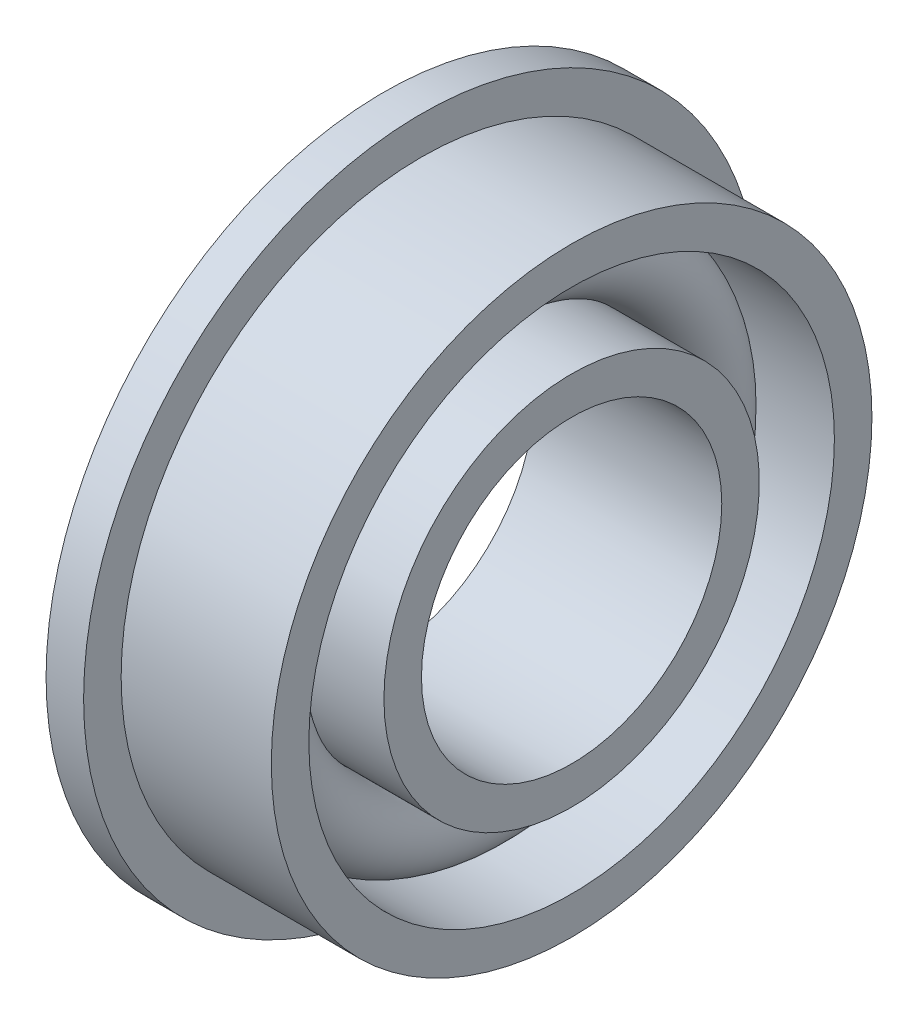
ISO-10303-21;
HEADER;
FILE_DESCRIPTION(('STEP AP214'),'2;1');
FILE_NAME('part.step','',(''),(''),'','','');
FILE_SCHEMA(('AUTOMOTIVE_DESIGN { 1 0 10303 214 1 1 1 1 }'));
ENDSEC;
DATA;
#1=APPLICATION_CONTEXT('core data for automotive mechanical design processes');
#2=APPLICATION_PROTOCOL_DEFINITION('international standard','automotive_design',2000,#1);
#3=PRODUCT_CONTEXT('',#1,'mechanical');
#4=PRODUCT('Part','Part','',(#3));
#5=PRODUCT_RELATED_PRODUCT_CATEGORY('part','',(#4));
#6=PRODUCT_DEFINITION_FORMATION('','',#4);
#7=PRODUCT_DEFINITION_CONTEXT('part definition',#1,'design');
#8=PRODUCT_DEFINITION('design','',#6,#7);
#9=PRODUCT_DEFINITION_SHAPE('','',#8);
#10=(LENGTH_UNIT() NAMED_UNIT(*) SI_UNIT(.MILLI.,.METRE.));
#11=(NAMED_UNIT(*) PLANE_ANGLE_UNIT() SI_UNIT($,.RADIAN.));
#12=(NAMED_UNIT(*) SI_UNIT($,.STERADIAN.) SOLID_ANGLE_UNIT());
#13=UNCERTAINTY_MEASURE_WITH_UNIT(LENGTH_MEASURE(1.E-05),#10,'distance_accuracy_value','');
#14=(GEOMETRIC_REPRESENTATION_CONTEXT(3) GLOBAL_UNCERTAINTY_ASSIGNED_CONTEXT((#13)) GLOBAL_UNIT_ASSIGNED_CONTEXT((#10,
#11,#12)) REPRESENTATION_CONTEXT('',''));
#15=CARTESIAN_POINT('',(0.,0.,0.));
#16=DIRECTION('',(0.,0.,1.));
#17=DIRECTION('',(1.,0.,0.));
#18=AXIS2_PLACEMENT_3D('',#15,#16,#17);
#19=CARTESIAN_POINT('',(0.,0.,0.));
#20=DIRECTION('',(-1.,0.,0.));
#21=DIRECTION('',(0.,0.,1.));
#22=AXIS2_PLACEMENT_3D('',#19,#20,#21);
#23=CYLINDRICAL_SURFACE('',#22,5.);
#24=CARTESIAN_POINT('',(0.,0.,0.));
#25=DIRECTION('',(-1.,0.,0.));
#26=DIRECTION('',(0.,0.,1.));
#27=AXIS2_PLACEMENT_3D('',#24,#25,#26);
#28=CIRCLE('',#27,5.);
#29=CARTESIAN_POINT('',(0.,0.,5.));
#30=VERTEX_POINT('',#29);
#31=EDGE_CURVE('E11',#30,#30,#28,.T.);
#32=ORIENTED_EDGE('',*,*,#31,.F.);
#33=EDGE_LOOP('',(#32));
#34=FACE_BOUND('',#33,.T.);
#35=CARTESIAN_POINT('',(5.,0.,0.));
#36=DIRECTION('',(-1.,0.,0.));
#37=DIRECTION('',(0.,0.,1.));
#38=AXIS2_PLACEMENT_3D('',#35,#36,#37);
#39=CIRCLE('',#38,5.);
#40=CARTESIAN_POINT('',(5.,0.,5.));
#41=VERTEX_POINT('',#40);
#42=EDGE_CURVE('E51',#41,#41,#39,.T.);
#43=ORIENTED_EDGE('',*,*,#42,.T.);
#44=EDGE_LOOP('',(#43));
#45=FACE_BOUND('',#44,.T.);
#46=ADVANCED_FACE('F37',(#34,#45),#23,.T.);
#47=CARTESIAN_POINT('',(0.,0.,0.));
#48=DIRECTION('',(1.,0.,0.));
#49=DIRECTION('',(0.,0.,-1.));
#50=AXIS2_PLACEMENT_3D('',#47,#48,#49);
#51=PLANE('',#50);
#52=CARTESIAN_POINT('',(0.,0.,0.));
#53=DIRECTION('',(-1.,0.,0.));
#54=DIRECTION('',(0.,0.,1.));
#55=AXIS2_PLACEMENT_3D('',#52,#53,#54);
#56=CIRCLE('',#55,4.);
#57=CARTESIAN_POINT('',(0.,0.,4.));
#58=VERTEX_POINT('',#57);
#59=EDGE_CURVE('E43',#58,#58,#56,.T.);
#60=ORIENTED_EDGE('',*,*,#59,.F.);
#61=EDGE_LOOP('',(#60));
#62=FACE_BOUND('',#61,.T.);
#63=ORIENTED_EDGE('',*,*,#31,.T.);
#64=EDGE_LOOP('',(#63));
#65=FACE_BOUND('',#64,.T.);
#66=ADVANCED_FACE('F66',(#62,#65),#51,.F.);
#67=CARTESIAN_POINT('',(0.,0.,0.));
#68=DIRECTION('',(-1.,0.,0.));
#69=DIRECTION('',(0.,0.,1.));
#70=AXIS2_PLACEMENT_3D('',#67,#68,#69);
#71=CYLINDRICAL_SURFACE('',#70,4.);
#72=CARTESIAN_POINT('',(5.,0.,0.));
#73=DIRECTION('',(-1.,0.,0.));
#74=DIRECTION('',(0.,0.,1.));
#75=AXIS2_PLACEMENT_3D('',#72,#73,#74);
#76=CIRCLE('',#75,4.);
#77=CARTESIAN_POINT('',(5.,0.,4.));
#78=VERTEX_POINT('',#77);
#79=EDGE_CURVE('E47',#78,#78,#76,.T.);
#80=ORIENTED_EDGE('',*,*,#79,.F.);
#81=EDGE_LOOP('',(#80));
#82=FACE_BOUND('',#81,.T.);
#83=ORIENTED_EDGE('',*,*,#59,.T.);
#84=EDGE_LOOP('',(#83));
#85=FACE_BOUND('',#84,.T.);
#86=ADVANCED_FACE('F61',(#82,#85),#71,.F.);
#87=CARTESIAN_POINT('',(5.,0.,0.));
#88=DIRECTION('',(-1.,0.,0.));
#89=DIRECTION('',(0.,0.,1.));
#90=AXIS2_PLACEMENT_3D('',#87,#88,#89);
#91=PLANE('',#90);
#92=ORIENTED_EDGE('',*,*,#42,.F.);
#93=EDGE_LOOP('',(#92));
#94=FACE_BOUND('',#93,.T.);
#95=ORIENTED_EDGE('',*,*,#79,.T.);
#96=EDGE_LOOP('',(#95));
#97=FACE_BOUND('',#96,.T.);
#98=ADVANCED_FACE('F58',(#94,#97),#91,.F.);
#99=CLOSED_SHELL('',(#46,#66,#86,#98));
#100=MANIFOLD_SOLID_BREP('B2',#99);
#101=CARTESIAN_POINT('',(2.5,0.,0.));
#102=DIRECTION('',(-1.,0.,0.));
#103=DIRECTION('',(0.,0.,1.));
#104=AXIS2_PLACEMENT_3D('',#101,#102,#103);
#105=TOROIDAL_SURFACE('',#104,6.,1.);
#106=CARTESIAN_POINT('',(2.5,0.,7.));
#107=VERTEX_POINT('',#106);
#108=VERTEX_LOOP('',#107);
#109=FACE_BOUND('',#108,.T.);
#110=ADVANCED_FACE('F105',(#109),#105,.T.);
#111=CLOSED_SHELL('',(#110));
#112=MANIFOLD_SOLID_BREP('B6',#111);
#113=CARTESIAN_POINT('',(5.,0.,0.));
#114=DIRECTION('',(1.,0.,0.));
#115=DIRECTION('',(0.,0.,-1.));
#116=AXIS2_PLACEMENT_3D('',#113,#114,#115);
#117=PLANE('',#116);
#118=CARTESIAN_POINT('',(5.,0.,0.));
#119=DIRECTION('',(-1.,0.,0.));
#120=DIRECTION('',(0.,0.,1.));
#121=AXIS2_PLACEMENT_3D('',#118,#119,#120);
#122=CIRCLE('',#121,7.);
#123=CARTESIAN_POINT('',(5.,0.,7.));
#124=VERTEX_POINT('',#123);
#125=EDGE_CURVE('E139',#124,#124,#122,.T.);
#126=ORIENTED_EDGE('',*,*,#125,.T.);
#127=EDGE_LOOP('',(#126));
#128=FACE_BOUND('',#127,.T.);
#129=CARTESIAN_POINT('',(5.,0.,0.));
#130=DIRECTION('',(-1.,0.,0.));
#131=DIRECTION('',(0.,0.,1.));
#132=AXIS2_PLACEMENT_3D('',#129,#130,#131);
#133=CIRCLE('',#132,8.);
#134=CARTESIAN_POINT('',(5.,0.,8.));
#135=VERTEX_POINT('',#134);
#136=EDGE_CURVE('E104',#135,#135,#133,.T.);
#137=ORIENTED_EDGE('',*,*,#136,.F.);
#138=EDGE_LOOP('',(#137));
#139=FACE_BOUND('',#138,.T.);
#140=ADVANCED_FACE('F117',(#128,#139),#117,.T.);
#141=CARTESIAN_POINT('',(0.,0.,0.));
#142=DIRECTION('',(-1.,0.,0.));
#143=DIRECTION('',(0.,0.,1.));
#144=AXIS2_PLACEMENT_3D('',#141,#142,#143);
#145=CYLINDRICAL_SURFACE('',#144,8.);
#146=ORIENTED_EDGE('',*,*,#136,.T.);
#147=EDGE_LOOP('',(#146));
#148=FACE_BOUND('',#147,.T.);
#149=CARTESIAN_POINT('',(1.,0.,0.));
#150=DIRECTION('',(-1.,0.,0.));
#151=DIRECTION('',(0.,0.,1.));
#152=AXIS2_PLACEMENT_3D('',#149,#150,#151);
#153=CIRCLE('',#152,8.);
#154=CARTESIAN_POINT('',(1.,0.,8.));
#155=VERTEX_POINT('',#154);
#156=EDGE_CURVE('E123',#155,#155,#153,.T.);
#157=ORIENTED_EDGE('',*,*,#156,.F.);
#158=EDGE_LOOP('',(#157));
#159=FACE_BOUND('',#158,.T.);
#160=ADVANCED_FACE('F157',(#148,#159),#145,.T.);
#161=CARTESIAN_POINT('',(1.,0.,0.));
#162=DIRECTION('',(1.,0.,0.));
#163=DIRECTION('',(0.,0.,-1.));
#164=AXIS2_PLACEMENT_3D('',#161,#162,#163);
#165=PLANE('',#164);
#166=ORIENTED_EDGE('',*,*,#156,.T.);
#167=EDGE_LOOP('',(#166));
#168=FACE_BOUND('',#167,.T.);
#169=CARTESIAN_POINT('',(1.,0.,0.));
#170=DIRECTION('',(-1.,0.,0.));
#171=DIRECTION('',(0.,0.,1.));
#172=AXIS2_PLACEMENT_3D('',#169,#170,#171);
#173=CIRCLE('',#172,9.);
#174=CARTESIAN_POINT('',(1.,0.,9.));
#175=VERTEX_POINT('',#174);
#176=EDGE_CURVE('E127',#175,#175,#173,.T.);
#177=ORIENTED_EDGE('',*,*,#176,.F.);
#178=EDGE_LOOP('',(#177));
#179=FACE_BOUND('',#178,.T.);
#180=ADVANCED_FACE('F161',(#168,#179),#165,.T.);
#181=CARTESIAN_POINT('',(0.,0.,0.));
#182=DIRECTION('',(-1.,0.,0.));
#183=DIRECTION('',(0.,0.,1.));
#184=AXIS2_PLACEMENT_3D('',#181,#182,#183);
#185=CYLINDRICAL_SURFACE('',#184,9.);
#186=ORIENTED_EDGE('',*,*,#176,.T.);
#187=EDGE_LOOP('',(#186));
#188=FACE_BOUND('',#187,.T.);
#189=CARTESIAN_POINT('',(0.,0.,0.));
#190=DIRECTION('',(-1.,0.,0.));
#191=DIRECTION('',(0.,0.,1.));
#192=AXIS2_PLACEMENT_3D('',#189,#190,#191);
#193=CIRCLE('',#192,9.);
#194=CARTESIAN_POINT('',(0.,0.,9.));
#195=VERTEX_POINT('',#194);
#196=EDGE_CURVE('E131',#195,#195,#193,.T.);
#197=ORIENTED_EDGE('',*,*,#196,.F.);
#198=EDGE_LOOP('',(#197));
#199=FACE_BOUND('',#198,.T.);
#200=ADVANCED_FACE('F153',(#188,#199),#185,.T.);
#201=CARTESIAN_POINT('',(0.,0.,0.));
#202=DIRECTION('',(-1.,0.,0.));
#203=DIRECTION('',(0.,0.,1.));
#204=AXIS2_PLACEMENT_3D('',#201,#202,#203);
#205=PLANE('',#204);
#206=ORIENTED_EDGE('',*,*,#196,.T.);
#207=EDGE_LOOP('',(#206));
#208=FACE_BOUND('',#207,.T.);
#209=CARTESIAN_POINT('',(0.,0.,0.));
#210=DIRECTION('',(-1.,0.,0.));
#211=DIRECTION('',(0.,0.,1.));
#212=AXIS2_PLACEMENT_3D('',#209,#210,#211);
#213=CIRCLE('',#212,7.);
#214=CARTESIAN_POINT('',(0.,0.,7.));
#215=VERTEX_POINT('',#214);
#216=EDGE_CURVE('E136',#215,#215,#213,.T.);
#217=ORIENTED_EDGE('',*,*,#216,.F.);
#218=EDGE_LOOP('',(#217));
#219=FACE_BOUND('',#218,.T.);
#220=ADVANCED_FACE('F147',(#208,#219),#205,.T.);
#221=CARTESIAN_POINT('',(0.,0.,0.));
#222=DIRECTION('',(-1.,0.,0.));
#223=DIRECTION('',(0.,0.,1.));
#224=AXIS2_PLACEMENT_3D('',#221,#222,#223);
#225=CYLINDRICAL_SURFACE('',#224,7.);
#226=ORIENTED_EDGE('',*,*,#216,.T.);
#227=EDGE_LOOP('',(#226));
#228=FACE_BOUND('',#227,.T.);
#229=ORIENTED_EDGE('',*,*,#125,.F.);
#230=EDGE_LOOP('',(#229));
#231=FACE_BOUND('',#230,.T.);
#232=ADVANCED_FACE('F145',(#228,#231),#225,.F.);
#233=CLOSED_SHELL('',(#140,#160,#180,#200,#220,#232));
#234=MANIFOLD_SOLID_BREP('B33',#233);
#235=ADVANCED_BREP_SHAPE_REPRESENTATION('',(#18,#100,#112,#234),#14);
#236=SHAPE_DEFINITION_REPRESENTATION(#9,#235);
ENDSEC;
END-ISO-10303-21;
